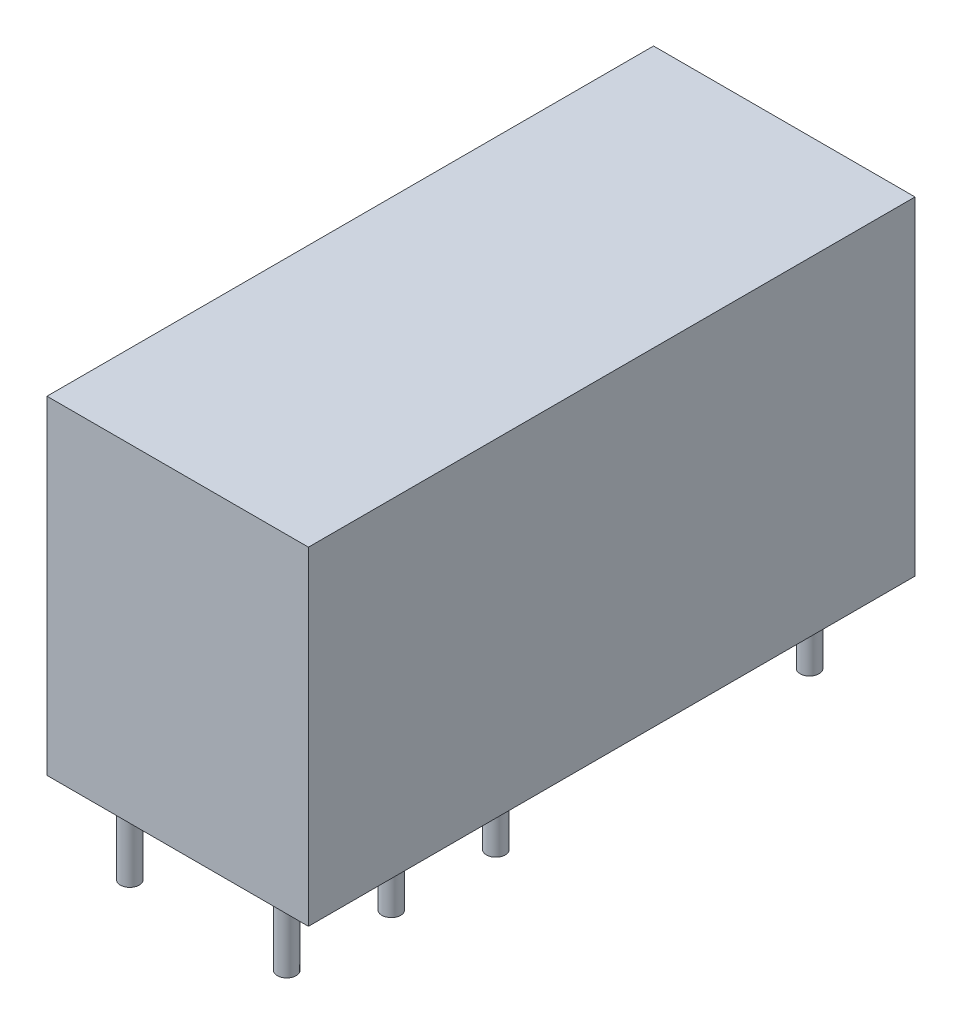
ISO-10303-21;
HEADER;
FILE_DESCRIPTION(('STEP AP214'),'2;1');
FILE_NAME('part.step','',(''),(''),'','','');
FILE_SCHEMA(('AUTOMOTIVE_DESIGN { 1 0 10303 214 1 1 1 1 }'));
ENDSEC;
DATA;
#1=APPLICATION_CONTEXT('core data for automotive mechanical design processes');
#2=APPLICATION_PROTOCOL_DEFINITION('international standard','automotive_design',2000,#1);
#3=PRODUCT_CONTEXT('',#1,'mechanical');
#4=PRODUCT('Part','Part','',(#3));
#5=PRODUCT_RELATED_PRODUCT_CATEGORY('part','',(#4));
#6=PRODUCT_DEFINITION_FORMATION('','',#4);
#7=PRODUCT_DEFINITION_CONTEXT('part definition',#1,'design');
#8=PRODUCT_DEFINITION('design','',#6,#7);
#9=PRODUCT_DEFINITION_SHAPE('','',#8);
#10=(LENGTH_UNIT() NAMED_UNIT(*) SI_UNIT(.MILLI.,.METRE.));
#11=(NAMED_UNIT(*) PLANE_ANGLE_UNIT() SI_UNIT($,.RADIAN.));
#12=(NAMED_UNIT(*) SI_UNIT($,.STERADIAN.) SOLID_ANGLE_UNIT());
#13=UNCERTAINTY_MEASURE_WITH_UNIT(LENGTH_MEASURE(1.E-05),#10,'distance_accuracy_value','');
#14=(GEOMETRIC_REPRESENTATION_CONTEXT(3) GLOBAL_UNCERTAINTY_ASSIGNED_CONTEXT((#13)) GLOBAL_UNIT_ASSIGNED_CONTEXT((#10,
#11,#12)) REPRESENTATION_CONTEXT('',''));
#15=CARTESIAN_POINT('',(0.,0.,0.));
#16=DIRECTION('',(0.,0.,1.));
#17=DIRECTION('',(1.,0.,0.));
#18=AXIS2_PLACEMENT_3D('',#15,#16,#17);
#19=CARTESIAN_POINT('',(-6.25,15.7,14.5));
#20=DIRECTION('',(1.,0.,0.));
#21=DIRECTION('',(0.,0.,-1.));
#22=AXIS2_PLACEMENT_3D('',#19,#20,#21);
#23=PLANE('',#22);
#24=DIRECTION('',(0.,0.,1.));
#25=VECTOR('',#24,1.);
#26=CARTESIAN_POINT('',(-6.25,0.,14.5));
#27=LINE('',#26,#25);
#28=CARTESIAN_POINT('',(-6.25,0.,-14.5));
#29=VERTEX_POINT('',#28);
#30=CARTESIAN_POINT('',(-6.25,0.,14.5));
#31=VERTEX_POINT('',#30);
#32=EDGE_CURVE('E114',#29,#31,#27,.T.);
#33=ORIENTED_EDGE('',*,*,#32,.T.);
#34=DIRECTION('',(0.,-1.,0.));
#35=VECTOR('',#34,1.);
#36=CARTESIAN_POINT('',(-6.25,15.7,14.5));
#37=LINE('',#36,#35);
#38=CARTESIAN_POINT('',(-6.25,15.7,14.5));
#39=VERTEX_POINT('',#38);
#40=EDGE_CURVE('E11',#39,#31,#37,.T.);
#41=ORIENTED_EDGE('',*,*,#40,.F.);
#42=DIRECTION('',(0.,0.,1.));
#43=VECTOR('',#42,1.);
#44=CARTESIAN_POINT('',(-6.25,15.7,14.5));
#45=LINE('',#44,#43);
#46=CARTESIAN_POINT('',(-6.25,15.7,-14.5));
#47=VERTEX_POINT('',#46);
#48=EDGE_CURVE('E100',#47,#39,#45,.T.);
#49=ORIENTED_EDGE('',*,*,#48,.F.);
#50=DIRECTION('',(0.,-1.,0.));
#51=VECTOR('',#50,1.);
#52=CARTESIAN_POINT('',(-6.25,15.7,-14.5));
#53=LINE('',#52,#51);
#54=EDGE_CURVE('E108',#47,#29,#53,.T.);
#55=ORIENTED_EDGE('',*,*,#54,.T.);
#56=EDGE_LOOP('',(#33,#41,#49,#55));
#57=FACE_BOUND('',#56,.T.);
#58=ADVANCED_FACE('F44',(#57),#23,.F.);
#59=CARTESIAN_POINT('',(6.25,15.7,14.5));
#60=DIRECTION('',(0.,0.,-1.));
#61=DIRECTION('',(-1.,0.,0.));
#62=AXIS2_PLACEMENT_3D('',#59,#60,#61);
#63=PLANE('',#62);
#64=DIRECTION('',(1.,0.,0.));
#65=VECTOR('',#64,1.);
#66=CARTESIAN_POINT('',(6.25,0.,14.5));
#67=LINE('',#66,#65);
#68=CARTESIAN_POINT('',(6.25,0.,14.5));
#69=VERTEX_POINT('',#68);
#70=EDGE_CURVE('E105',#31,#69,#67,.T.);
#71=ORIENTED_EDGE('',*,*,#70,.T.);
#72=DIRECTION('',(0.,-1.,0.));
#73=VECTOR('',#72,1.);
#74=CARTESIAN_POINT('',(6.25,15.7,14.5));
#75=LINE('',#74,#73);
#76=CARTESIAN_POINT('',(6.25,15.7,14.5));
#77=VERTEX_POINT('',#76);
#78=EDGE_CURVE('E53',#77,#69,#75,.T.);
#79=ORIENTED_EDGE('',*,*,#78,.F.);
#80=DIRECTION('',(1.,0.,0.));
#81=VECTOR('',#80,1.);
#82=CARTESIAN_POINT('',(6.25,15.7,14.5));
#83=LINE('',#82,#81);
#84=EDGE_CURVE('E95',#39,#77,#83,.T.);
#85=ORIENTED_EDGE('',*,*,#84,.F.);
#86=ORIENTED_EDGE('',*,*,#40,.T.);
#87=EDGE_LOOP('',(#71,#79,#85,#86));
#88=FACE_BOUND('',#87,.T.);
#89=ADVANCED_FACE('F101',(#88),#63,.F.);
#90=CARTESIAN_POINT('',(6.25,15.7,14.5));
#91=DIRECTION('',(-1.,0.,0.));
#92=DIRECTION('',(0.,0.,1.));
#93=AXIS2_PLACEMENT_3D('',#90,#91,#92);
#94=PLANE('',#93);
#95=DIRECTION('',(0.,0.,-1.));
#96=VECTOR('',#95,1.);
#97=CARTESIAN_POINT('',(6.25,0.,14.5));
#98=LINE('',#97,#96);
#99=CARTESIAN_POINT('',(6.25,0.,-14.5));
#100=VERTEX_POINT('',#99);
#101=EDGE_CURVE('E76',#69,#100,#98,.T.);
#102=ORIENTED_EDGE('',*,*,#101,.T.);
#103=DIRECTION('',(0.,-1.,0.));
#104=VECTOR('',#103,1.);
#105=CARTESIAN_POINT('',(6.25,15.7,-14.5));
#106=LINE('',#105,#104);
#107=CARTESIAN_POINT('',(6.25,15.7,-14.5));
#108=VERTEX_POINT('',#107);
#109=EDGE_CURVE('E102',#108,#100,#106,.T.);
#110=ORIENTED_EDGE('',*,*,#109,.F.);
#111=DIRECTION('',(0.,0.,-1.));
#112=VECTOR('',#111,1.);
#113=CARTESIAN_POINT('',(6.25,15.7,14.5));
#114=LINE('',#113,#112);
#115=EDGE_CURVE('E92',#77,#108,#114,.T.);
#116=ORIENTED_EDGE('',*,*,#115,.F.);
#117=ORIENTED_EDGE('',*,*,#78,.T.);
#118=EDGE_LOOP('',(#102,#110,#116,#117));
#119=FACE_BOUND('',#118,.T.);
#120=ADVANCED_FACE('F104',(#119),#94,.F.);
#121=CARTESIAN_POINT('',(6.25,15.7,-14.5));
#122=DIRECTION('',(0.,0.,1.));
#123=DIRECTION('',(1.,0.,0.));
#124=AXIS2_PLACEMENT_3D('',#121,#122,#123);
#125=PLANE('',#124);
#126=DIRECTION('',(-1.,0.,0.));
#127=VECTOR('',#126,1.);
#128=CARTESIAN_POINT('',(6.25,0.,-14.5));
#129=LINE('',#128,#127);
#130=EDGE_CURVE('E85',#100,#29,#129,.T.);
#131=ORIENTED_EDGE('',*,*,#130,.T.);
#132=ORIENTED_EDGE('',*,*,#54,.F.);
#133=DIRECTION('',(-1.,0.,0.));
#134=VECTOR('',#133,1.);
#135=CARTESIAN_POINT('',(6.25,15.7,-14.5));
#136=LINE('',#135,#134);
#137=EDGE_CURVE('E65',#108,#47,#136,.T.);
#138=ORIENTED_EDGE('',*,*,#137,.F.);
#139=ORIENTED_EDGE('',*,*,#109,.T.);
#140=EDGE_LOOP('',(#131,#132,#138,#139));
#141=FACE_BOUND('',#140,.T.);
#142=ADVANCED_FACE('F130',(#141),#125,.F.);
#143=CARTESIAN_POINT('',(0.,15.7,0.));
#144=DIRECTION('',(0.,1.,0.));
#145=DIRECTION('',(0.,0.,1.));
#146=AXIS2_PLACEMENT_3D('',#143,#144,#145);
#147=PLANE('',#146);
#148=ORIENTED_EDGE('',*,*,#48,.T.);
#149=ORIENTED_EDGE('',*,*,#84,.T.);
#150=ORIENTED_EDGE('',*,*,#115,.T.);
#151=ORIENTED_EDGE('',*,*,#137,.T.);
#152=EDGE_LOOP('',(#148,#149,#150,#151));
#153=FACE_BOUND('',#152,.T.);
#154=ADVANCED_FACE('F91',(#153),#147,.T.);
#155=CARTESIAN_POINT('',(0.,0.,0.));
#156=DIRECTION('',(0.,1.,0.));
#157=DIRECTION('',(0.,0.,1.));
#158=AXIS2_PLACEMENT_3D('',#155,#156,#157);
#159=PLANE('',#158);
#160=CARTESIAN_POINT('',(-3.75,0.,8.04));
#161=DIRECTION('',(0.,1.,0.));
#162=DIRECTION('',(0.,0.,1.));
#163=AXIS2_PLACEMENT_3D('',#160,#161,#162);
#164=CIRCLE('',#163,0.45);
#165=CARTESIAN_POINT('',(-3.75,0.,8.49));
#166=VERTEX_POINT('',#165);
#167=EDGE_CURVE('E139',#166,#166,#164,.T.);
#168=ORIENTED_EDGE('',*,*,#167,.T.);
#169=EDGE_LOOP('',(#168));
#170=FACE_BOUND('',#169,.T.);
#171=CARTESIAN_POINT('',(-3.75,0.,3.04));
#172=DIRECTION('',(0.,1.,0.));
#173=DIRECTION('',(0.,0.,1.));
#174=AXIS2_PLACEMENT_3D('',#171,#172,#173);
#175=CIRCLE('',#174,0.45);
#176=CARTESIAN_POINT('',(-3.75,0.,3.49));
#177=VERTEX_POINT('',#176);
#178=EDGE_CURVE('E162',#177,#177,#175,.T.);
#179=ORIENTED_EDGE('',*,*,#178,.T.);
#180=EDGE_LOOP('',(#179));
#181=FACE_BOUND('',#180,.T.);
#182=CARTESIAN_POINT('',(-3.75,0.,-11.96));
#183=DIRECTION('',(0.,1.,0.));
#184=DIRECTION('',(0.,0.,1.));
#185=AXIS2_PLACEMENT_3D('',#182,#183,#184);
#186=CIRCLE('',#185,0.45);
#187=CARTESIAN_POINT('',(-3.75,0.,-11.51));
#188=VERTEX_POINT('',#187);
#189=EDGE_CURVE('E154',#188,#188,#186,.T.);
#190=ORIENTED_EDGE('',*,*,#189,.T.);
#191=EDGE_LOOP('',(#190));
#192=FACE_BOUND('',#191,.T.);
#193=CARTESIAN_POINT('',(3.75,0.,-11.96));
#194=DIRECTION('',(0.,1.,0.));
#195=DIRECTION('',(0.,0.,-1.));
#196=AXIS2_PLACEMENT_3D('',#193,#194,#195);
#197=CIRCLE('',#196,0.450000000000001);
#198=CARTESIAN_POINT('',(3.75,0.,-12.41));
#199=VERTEX_POINT('',#198);
#200=EDGE_CURVE('E148',#199,#199,#197,.T.);
#201=ORIENTED_EDGE('',*,*,#200,.T.);
#202=EDGE_LOOP('',(#201));
#203=FACE_BOUND('',#202,.T.);
#204=CARTESIAN_POINT('',(3.75,0.,3.04));
#205=DIRECTION('',(0.,1.,0.));
#206=DIRECTION('',(0.,0.,-1.));
#207=AXIS2_PLACEMENT_3D('',#204,#205,#206);
#208=CIRCLE('',#207,0.450000000000001);
#209=CARTESIAN_POINT('',(3.75,0.,2.59));
#210=VERTEX_POINT('',#209);
#211=EDGE_CURVE('E150',#210,#210,#208,.T.);
#212=ORIENTED_EDGE('',*,*,#211,.T.);
#213=EDGE_LOOP('',(#212));
#214=FACE_BOUND('',#213,.T.);
#215=CARTESIAN_POINT('',(3.75,0.,8.04));
#216=DIRECTION('',(0.,1.,0.));
#217=DIRECTION('',(0.,0.,-1.));
#218=AXIS2_PLACEMENT_3D('',#215,#216,#217);
#219=CIRCLE('',#218,0.450000000000001);
#220=CARTESIAN_POINT('',(3.75,0.,7.59));
#221=VERTEX_POINT('',#220);
#222=EDGE_CURVE('E187',#221,#221,#219,.T.);
#223=ORIENTED_EDGE('',*,*,#222,.T.);
#224=EDGE_LOOP('',(#223));
#225=FACE_BOUND('',#224,.T.);
#226=CARTESIAN_POINT('',(3.75,0.,13.04));
#227=DIRECTION('',(0.,1.,0.));
#228=DIRECTION('',(0.,0.,-1.));
#229=AXIS2_PLACEMENT_3D('',#226,#227,#228);
#230=CIRCLE('',#229,0.450000000000001);
#231=CARTESIAN_POINT('',(3.75,0.,12.59));
#232=VERTEX_POINT('',#231);
#233=EDGE_CURVE('E179',#232,#232,#230,.T.);
#234=ORIENTED_EDGE('',*,*,#233,.T.);
#235=EDGE_LOOP('',(#234));
#236=FACE_BOUND('',#235,.T.);
#237=CARTESIAN_POINT('',(-3.75,0.,13.04));
#238=DIRECTION('',(0.,1.,0.));
#239=DIRECTION('',(0.,0.,1.));
#240=AXIS2_PLACEMENT_3D('',#237,#238,#239);
#241=CIRCLE('',#240,0.45);
#242=CARTESIAN_POINT('',(-3.75,0.,13.49));
#243=VERTEX_POINT('',#242);
#244=EDGE_CURVE('E131',#243,#243,#241,.T.);
#245=ORIENTED_EDGE('',*,*,#244,.T.);
#246=EDGE_LOOP('',(#245));
#247=FACE_BOUND('',#246,.T.);
#248=ORIENTED_EDGE('',*,*,#32,.F.);
#249=ORIENTED_EDGE('',*,*,#130,.F.);
#250=ORIENTED_EDGE('',*,*,#101,.F.);
#251=ORIENTED_EDGE('',*,*,#70,.F.);
#252=EDGE_LOOP('',(#248,#249,#250,#251));
#253=FACE_BOUND('',#252,.T.);
#254=ADVANCED_FACE('F128',(#170,#181,#192,#203,#214,#225,#236,#247,#253),#159,.F.);
#255=CARTESIAN_POINT('',(-3.75,-3.8,13.04));
#256=DIRECTION('',(0.,1.,0.));
#257=DIRECTION('',(0.,0.,1.));
#258=AXIS2_PLACEMENT_3D('',#255,#256,#257);
#259=CYLINDRICAL_SURFACE('',#258,0.45);
#260=CARTESIAN_POINT('',(-3.75,-3.8,13.04));
#261=DIRECTION('',(0.,1.,0.));
#262=DIRECTION('',(0.,0.,1.));
#263=AXIS2_PLACEMENT_3D('',#260,#261,#262);
#264=CIRCLE('',#263,0.45);
#265=CARTESIAN_POINT('',(-3.75,-3.8,13.49));
#266=VERTEX_POINT('',#265);
#267=EDGE_CURVE('E120',#266,#266,#264,.T.);
#268=ORIENTED_EDGE('',*,*,#267,.T.);
#269=EDGE_LOOP('',(#268));
#270=FACE_BOUND('',#269,.T.);
#271=ORIENTED_EDGE('',*,*,#244,.F.);
#272=EDGE_LOOP('',(#271));
#273=FACE_BOUND('',#272,.T.);
#274=ADVANCED_FACE('F226',(#270,#273),#259,.T.);
#275=CARTESIAN_POINT('',(-3.75,-3.8,13.04));
#276=DIRECTION('',(0.,1.,0.));
#277=DIRECTION('',(0.,0.,1.));
#278=AXIS2_PLACEMENT_3D('',#275,#276,#277);
#279=PLANE('',#278);
#280=ORIENTED_EDGE('',*,*,#267,.F.);
#281=EDGE_LOOP('',(#280));
#282=FACE_BOUND('',#281,.T.);
#283=ADVANCED_FACE('F235',(#282),#279,.F.);
#284=CARTESIAN_POINT('',(3.75,-3.8,13.04));
#285=DIRECTION('',(0.,1.,0.));
#286=DIRECTION('',(0.,0.,1.));
#287=AXIS2_PLACEMENT_3D('',#284,#285,#286);
#288=CYLINDRICAL_SURFACE('',#287,0.450000000000001);
#289=CARTESIAN_POINT('',(3.75,-3.8,13.04));
#290=DIRECTION('',(0.,1.,0.));
#291=DIRECTION('',(0.,0.,-1.));
#292=AXIS2_PLACEMENT_3D('',#289,#290,#291);
#293=CIRCLE('',#292,0.450000000000001);
#294=CARTESIAN_POINT('',(3.75,-3.8,12.59));
#295=VERTEX_POINT('',#294);
#296=EDGE_CURVE('E171',#295,#295,#293,.T.);
#297=ORIENTED_EDGE('',*,*,#296,.T.);
#298=EDGE_LOOP('',(#297));
#299=FACE_BOUND('',#298,.T.);
#300=ORIENTED_EDGE('',*,*,#233,.F.);
#301=EDGE_LOOP('',(#300));
#302=FACE_BOUND('',#301,.T.);
#303=ADVANCED_FACE('F239',(#299,#302),#288,.T.);
#304=CARTESIAN_POINT('',(3.75,-3.8,13.04));
#305=DIRECTION('',(0.,-1.,0.));
#306=DIRECTION('',(0.,0.,-1.));
#307=AXIS2_PLACEMENT_3D('',#304,#305,#306);
#308=PLANE('',#307);
#309=ORIENTED_EDGE('',*,*,#296,.F.);
#310=EDGE_LOOP('',(#309));
#311=FACE_BOUND('',#310,.T.);
#312=ADVANCED_FACE('F275',(#311),#308,.T.);
#313=CARTESIAN_POINT('',(3.75,-3.8,8.04));
#314=DIRECTION('',(0.,1.,0.));
#315=DIRECTION('',(0.,0.,1.));
#316=AXIS2_PLACEMENT_3D('',#313,#314,#315);
#317=CYLINDRICAL_SURFACE('',#316,0.450000000000001);
#318=CARTESIAN_POINT('',(3.75,-3.8,8.04));
#319=DIRECTION('',(0.,1.,0.));
#320=DIRECTION('',(0.,0.,-1.));
#321=AXIS2_PLACEMENT_3D('',#318,#319,#320);
#322=CIRCLE('',#321,0.450000000000001);
#323=CARTESIAN_POINT('',(3.75,-3.8,7.59));
#324=VERTEX_POINT('',#323);
#325=EDGE_CURVE('E185',#324,#324,#322,.T.);
#326=ORIENTED_EDGE('',*,*,#325,.T.);
#327=EDGE_LOOP('',(#326));
#328=FACE_BOUND('',#327,.T.);
#329=ORIENTED_EDGE('',*,*,#222,.F.);
#330=EDGE_LOOP('',(#329));
#331=FACE_BOUND('',#330,.T.);
#332=ADVANCED_FACE('F213',(#328,#331),#317,.T.);
#333=CARTESIAN_POINT('',(3.75,-3.8,8.04));
#334=DIRECTION('',(0.,-1.,0.));
#335=DIRECTION('',(0.,0.,-1.));
#336=AXIS2_PLACEMENT_3D('',#333,#334,#335);
#337=PLANE('',#336);
#338=ORIENTED_EDGE('',*,*,#325,.F.);
#339=EDGE_LOOP('',(#338));
#340=FACE_BOUND('',#339,.T.);
#341=ADVANCED_FACE('F201',(#340),#337,.T.);
#342=CARTESIAN_POINT('',(3.75,-3.8,3.04));
#343=DIRECTION('',(0.,1.,0.));
#344=DIRECTION('',(0.,0.,1.));
#345=AXIS2_PLACEMENT_3D('',#342,#343,#344);
#346=CYLINDRICAL_SURFACE('',#345,0.450000000000001);
#347=CARTESIAN_POINT('',(3.75,-3.8,3.04));
#348=DIRECTION('',(0.,1.,0.));
#349=DIRECTION('',(0.,0.,-1.));
#350=AXIS2_PLACEMENT_3D('',#347,#348,#349);
#351=CIRCLE('',#350,0.450000000000001);
#352=CARTESIAN_POINT('',(3.75,-3.8,2.59));
#353=VERTEX_POINT('',#352);
#354=EDGE_CURVE('E188',#353,#353,#351,.T.);
#355=ORIENTED_EDGE('',*,*,#354,.T.);
#356=EDGE_LOOP('',(#355));
#357=FACE_BOUND('',#356,.T.);
#358=ORIENTED_EDGE('',*,*,#211,.F.);
#359=EDGE_LOOP('',(#358));
#360=FACE_BOUND('',#359,.T.);
#361=ADVANCED_FACE('F199',(#357,#360),#346,.T.);
#362=CARTESIAN_POINT('',(3.75,-3.8,3.04));
#363=DIRECTION('',(0.,-1.,0.));
#364=DIRECTION('',(0.,0.,-1.));
#365=AXIS2_PLACEMENT_3D('',#362,#363,#364);
#366=PLANE('',#365);
#367=ORIENTED_EDGE('',*,*,#354,.F.);
#368=EDGE_LOOP('',(#367));
#369=FACE_BOUND('',#368,.T.);
#370=ADVANCED_FACE('F205',(#369),#366,.T.);
#371=CARTESIAN_POINT('',(3.75,-3.8,-11.96));
#372=DIRECTION('',(0.,1.,0.));
#373=DIRECTION('',(0.,0.,1.));
#374=AXIS2_PLACEMENT_3D('',#371,#372,#373);
#375=CYLINDRICAL_SURFACE('',#374,0.450000000000001);
#376=CARTESIAN_POINT('',(3.75,-3.8,-11.96));
#377=DIRECTION('',(0.,1.,0.));
#378=DIRECTION('',(0.,0.,-1.));
#379=AXIS2_PLACEMENT_3D('',#376,#377,#378);
#380=CIRCLE('',#379,0.450000000000001);
#381=CARTESIAN_POINT('',(3.75,-3.8,-12.41));
#382=VERTEX_POINT('',#381);
#383=EDGE_CURVE('E142',#382,#382,#380,.T.);
#384=ORIENTED_EDGE('',*,*,#383,.T.);
#385=EDGE_LOOP('',(#384));
#386=FACE_BOUND('',#385,.T.);
#387=ORIENTED_EDGE('',*,*,#200,.F.);
#388=EDGE_LOOP('',(#387));
#389=FACE_BOUND('',#388,.T.);
#390=ADVANCED_FACE('F209',(#386,#389),#375,.T.);
#391=CARTESIAN_POINT('',(3.75,-3.8,-11.96));
#392=DIRECTION('',(0.,-1.,0.));
#393=DIRECTION('',(0.,0.,-1.));
#394=AXIS2_PLACEMENT_3D('',#391,#392,#393);
#395=PLANE('',#394);
#396=ORIENTED_EDGE('',*,*,#383,.F.);
#397=EDGE_LOOP('',(#396));
#398=FACE_BOUND('',#397,.T.);
#399=ADVANCED_FACE('F242',(#398),#395,.T.);
#400=CARTESIAN_POINT('',(-3.75,-3.8,-11.96));
#401=DIRECTION('',(0.,1.,0.));
#402=DIRECTION('',(0.,0.,1.));
#403=AXIS2_PLACEMENT_3D('',#400,#401,#402);
#404=CYLINDRICAL_SURFACE('',#403,0.45);
#405=CARTESIAN_POINT('',(-3.75,-3.8,-11.96));
#406=DIRECTION('',(0.,1.,0.));
#407=DIRECTION('',(0.,0.,1.));
#408=AXIS2_PLACEMENT_3D('',#405,#406,#407);
#409=CIRCLE('',#408,0.45);
#410=CARTESIAN_POINT('',(-3.75,-3.8,-11.51));
#411=VERTEX_POINT('',#410);
#412=EDGE_CURVE('E151',#411,#411,#409,.T.);
#413=ORIENTED_EDGE('',*,*,#412,.T.);
#414=EDGE_LOOP('',(#413));
#415=FACE_BOUND('',#414,.T.);
#416=ORIENTED_EDGE('',*,*,#189,.F.);
#417=EDGE_LOOP('',(#416));
#418=FACE_BOUND('',#417,.T.);
#419=ADVANCED_FACE('F241',(#415,#418),#404,.T.);
#420=CARTESIAN_POINT('',(-3.75,-3.8,-11.96));
#421=DIRECTION('',(0.,1.,0.));
#422=DIRECTION('',(0.,0.,1.));
#423=AXIS2_PLACEMENT_3D('',#420,#421,#422);
#424=PLANE('',#423);
#425=ORIENTED_EDGE('',*,*,#412,.F.);
#426=EDGE_LOOP('',(#425));
#427=FACE_BOUND('',#426,.T.);
#428=ADVANCED_FACE('F248',(#427),#424,.F.);
#429=CARTESIAN_POINT('',(-3.75,-3.8,3.04));
#430=DIRECTION('',(0.,1.,0.));
#431=DIRECTION('',(0.,0.,1.));
#432=AXIS2_PLACEMENT_3D('',#429,#430,#431);
#433=CYLINDRICAL_SURFACE('',#432,0.45);
#434=CARTESIAN_POINT('',(-3.75,-3.8,3.04));
#435=DIRECTION('',(0.,1.,0.));
#436=DIRECTION('',(0.,0.,1.));
#437=AXIS2_PLACEMENT_3D('',#434,#435,#436);
#438=CIRCLE('',#437,0.45);
#439=CARTESIAN_POINT('',(-3.75,-3.8,3.49));
#440=VERTEX_POINT('',#439);
#441=EDGE_CURVE('E157',#440,#440,#438,.T.);
#442=ORIENTED_EDGE('',*,*,#441,.T.);
#443=EDGE_LOOP('',(#442));
#444=FACE_BOUND('',#443,.T.);
#445=ORIENTED_EDGE('',*,*,#178,.F.);
#446=EDGE_LOOP('',(#445));
#447=FACE_BOUND('',#446,.T.);
#448=ADVANCED_FACE('F252',(#444,#447),#433,.T.);
#449=CARTESIAN_POINT('',(-3.75,-3.8,3.04));
#450=DIRECTION('',(0.,1.,0.));
#451=DIRECTION('',(0.,0.,1.));
#452=AXIS2_PLACEMENT_3D('',#449,#450,#451);
#453=PLANE('',#452);
#454=ORIENTED_EDGE('',*,*,#441,.F.);
#455=EDGE_LOOP('',(#454));
#456=FACE_BOUND('',#455,.T.);
#457=ADVANCED_FACE('F260',(#456),#453,.F.);
#458=CARTESIAN_POINT('',(-3.75,-3.8,8.04));
#459=DIRECTION('',(0.,1.,0.));
#460=DIRECTION('',(0.,0.,1.));
#461=AXIS2_PLACEMENT_3D('',#458,#459,#460);
#462=CYLINDRICAL_SURFACE('',#461,0.45);
#463=CARTESIAN_POINT('',(-3.75,-3.8,8.04));
#464=DIRECTION('',(0.,1.,0.));
#465=DIRECTION('',(0.,0.,1.));
#466=AXIS2_PLACEMENT_3D('',#463,#464,#465);
#467=CIRCLE('',#466,0.45);
#468=CARTESIAN_POINT('',(-3.75,-3.8,8.49));
#469=VERTEX_POINT('',#468);
#470=EDGE_CURVE('E170',#469,#469,#467,.T.);
#471=ORIENTED_EDGE('',*,*,#470,.T.);
#472=EDGE_LOOP('',(#471));
#473=FACE_BOUND('',#472,.T.);
#474=ORIENTED_EDGE('',*,*,#167,.F.);
#475=EDGE_LOOP('',(#474));
#476=FACE_BOUND('',#475,.T.);
#477=ADVANCED_FACE('F257',(#473,#476),#462,.T.);
#478=CARTESIAN_POINT('',(-3.75,-3.8,8.04));
#479=DIRECTION('',(0.,1.,0.));
#480=DIRECTION('',(0.,0.,1.));
#481=AXIS2_PLACEMENT_3D('',#478,#479,#480);
#482=PLANE('',#481);
#483=ORIENTED_EDGE('',*,*,#470,.F.);
#484=EDGE_LOOP('',(#483));
#485=FACE_BOUND('',#484,.T.);
#486=ADVANCED_FACE('F264',(#485),#482,.F.);
#487=CLOSED_SHELL('',(#58,#89,#120,#142,#154,#254,#274,#283,#303,#312,#332,#341,#361,#370,#390,
#399,#419,#428,#448,#457,#477,#486));
#488=MANIFOLD_SOLID_BREP('B2',#487);
#489=ADVANCED_BREP_SHAPE_REPRESENTATION('',(#18,#488),#14);
#490=SHAPE_DEFINITION_REPRESENTATION(#9,#489);
ENDSEC;
END-ISO-10303-21;
